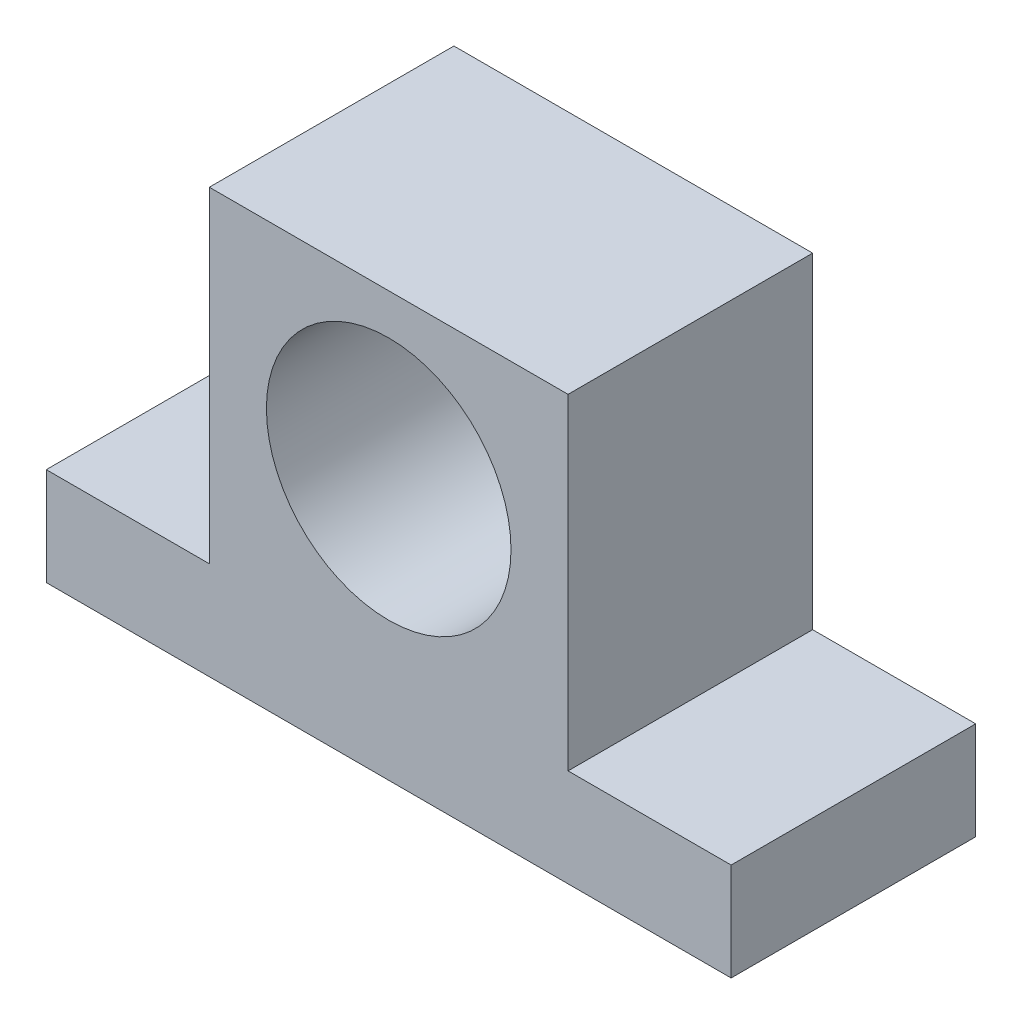
ISO-10303-21;
HEADER;
FILE_DESCRIPTION(('STEP AP214'),'2;1');
FILE_NAME('part.step','',(''),(''),'','','');
FILE_SCHEMA(('AUTOMOTIVE_DESIGN { 1 0 10303 214 1 1 1 1 }'));
ENDSEC;
DATA;
#1=APPLICATION_CONTEXT('core data for automotive mechanical design processes');
#2=APPLICATION_PROTOCOL_DEFINITION('international standard','automotive_design',2000,#1);
#3=PRODUCT_CONTEXT('',#1,'mechanical');
#4=PRODUCT('Part','Part','',(#3));
#5=PRODUCT_RELATED_PRODUCT_CATEGORY('part','',(#4));
#6=PRODUCT_DEFINITION_FORMATION('','',#4);
#7=PRODUCT_DEFINITION_CONTEXT('part definition',#1,'design');
#8=PRODUCT_DEFINITION('design','',#6,#7);
#9=PRODUCT_DEFINITION_SHAPE('','',#8);
#10=(LENGTH_UNIT() NAMED_UNIT(*) SI_UNIT(.MILLI.,.METRE.));
#11=(NAMED_UNIT(*) PLANE_ANGLE_UNIT() SI_UNIT($,.RADIAN.));
#12=(NAMED_UNIT(*) SI_UNIT($,.STERADIAN.) SOLID_ANGLE_UNIT());
#13=UNCERTAINTY_MEASURE_WITH_UNIT(LENGTH_MEASURE(1.E-05),#10,'distance_accuracy_value','');
#14=(GEOMETRIC_REPRESENTATION_CONTEXT(3) GLOBAL_UNCERTAINTY_ASSIGNED_CONTEXT((#13)) GLOBAL_UNIT_ASSIGNED_CONTEXT((#10,
#11,#12)) REPRESENTATION_CONTEXT('',''));
#15=CARTESIAN_POINT('',(0.,0.,0.));
#16=DIRECTION('',(0.,0.,1.));
#17=DIRECTION('',(1.,0.,0.));
#18=AXIS2_PLACEMENT_3D('',#15,#16,#17);
#19=CARTESIAN_POINT('',(0.,0.,15.));
#20=DIRECTION('',(0.,0.,1.));
#21=DIRECTION('',(1.,0.,0.));
#22=AXIS2_PLACEMENT_3D('',#19,#20,#21);
#23=PLANE('',#22);
#24=DIRECTION('',(0.,-1.,0.));
#25=VECTOR('',#24,1.);
#26=CARTESIAN_POINT('',(-11.,-10.,15.));
#27=LINE('',#26,#25);
#28=CARTESIAN_POINT('',(-11.,10.,15.));
#29=VERTEX_POINT('',#28);
#30=CARTESIAN_POINT('',(-11.,-10.,15.));
#31=VERTEX_POINT('',#30);
#32=EDGE_CURVE('E170',#29,#31,#27,.T.);
#33=ORIENTED_EDGE('',*,*,#32,.T.);
#34=DIRECTION('',(-1.,0.,0.));
#35=VECTOR('',#34,1.);
#36=CARTESIAN_POINT('',(-21.,-10.,15.));
#37=LINE('',#36,#35);
#38=CARTESIAN_POINT('',(-21.,-10.,15.));
#39=VERTEX_POINT('',#38);
#40=EDGE_CURVE('E106',#31,#39,#37,.T.);
#41=ORIENTED_EDGE('',*,*,#40,.T.);
#42=DIRECTION('',(0.,-1.,0.));
#43=VECTOR('',#42,1.);
#44=CARTESIAN_POINT('',(-21.,-10.,15.));
#45=LINE('',#44,#43);
#46=CARTESIAN_POINT('',(-21.,-16.,15.));
#47=VERTEX_POINT('',#46);
#48=EDGE_CURVE('E191',#39,#47,#45,.T.);
#49=ORIENTED_EDGE('',*,*,#48,.T.);
#50=DIRECTION('',(1.,0.,0.));
#51=VECTOR('',#50,1.);
#52=CARTESIAN_POINT('',(-21.,-16.,15.));
#53=LINE('',#52,#51);
#54=CARTESIAN_POINT('',(21.,-16.,15.));
#55=VERTEX_POINT('',#54);
#56=EDGE_CURVE('E205',#47,#55,#53,.T.);
#57=ORIENTED_EDGE('',*,*,#56,.T.);
#58=DIRECTION('',(0.,1.,0.));
#59=VECTOR('',#58,1.);
#60=CARTESIAN_POINT('',(21.,-10.,15.));
#61=LINE('',#60,#59);
#62=CARTESIAN_POINT('',(21.,-10.,15.));
#63=VERTEX_POINT('',#62);
#64=EDGE_CURVE('E125',#55,#63,#61,.T.);
#65=ORIENTED_EDGE('',*,*,#64,.T.);
#66=DIRECTION('',(-1.,0.,0.));
#67=VECTOR('',#66,1.);
#68=CARTESIAN_POINT('',(11.,-10.,15.));
#69=LINE('',#68,#67);
#70=CARTESIAN_POINT('',(11.,-10.,15.));
#71=VERTEX_POINT('',#70);
#72=EDGE_CURVE('E119',#63,#71,#69,.T.);
#73=ORIENTED_EDGE('',*,*,#72,.T.);
#74=DIRECTION('',(0.,1.,0.));
#75=VECTOR('',#74,1.);
#76=CARTESIAN_POINT('',(11.,-10.,15.));
#77=LINE('',#76,#75);
#78=CARTESIAN_POINT('',(11.,10.,15.));
#79=VERTEX_POINT('',#78);
#80=EDGE_CURVE('E123',#71,#79,#77,.T.);
#81=ORIENTED_EDGE('',*,*,#80,.T.);
#82=DIRECTION('',(-1.,0.,0.));
#83=VECTOR('',#82,1.);
#84=CARTESIAN_POINT('',(11.,10.,15.));
#85=LINE('',#84,#83);
#86=EDGE_CURVE('E63',#79,#29,#85,.T.);
#87=ORIENTED_EDGE('',*,*,#86,.T.);
#88=EDGE_LOOP('',(#33,#41,#49,#57,#65,#73,#81,#87));
#89=FACE_BOUND('',#88,.T.);
#90=CARTESIAN_POINT('',(0.,0.,15.));
#91=DIRECTION('',(0.,0.,1.));
#92=DIRECTION('',(1.,0.,0.));
#93=AXIS2_PLACEMENT_3D('',#90,#91,#92);
#94=CIRCLE('',#93,7.5);
#95=CARTESIAN_POINT('',(7.5,0.,15.));
#96=VERTEX_POINT('',#95);
#97=EDGE_CURVE('E152',#96,#96,#94,.T.);
#98=ORIENTED_EDGE('',*,*,#97,.F.);
#99=EDGE_LOOP('',(#98));
#100=FACE_BOUND('',#99,.T.);
#101=ADVANCED_FACE('F45',(#89,#100),#23,.T.);
#102=CARTESIAN_POINT('',(0.,0.,0.));
#103=DIRECTION('',(0.,0.,1.));
#104=DIRECTION('',(1.,0.,0.));
#105=AXIS2_PLACEMENT_3D('',#102,#103,#104);
#106=PLANE('',#105);
#107=DIRECTION('',(0.,-1.,0.));
#108=VECTOR('',#107,1.);
#109=CARTESIAN_POINT('',(-11.,-10.,0.));
#110=LINE('',#109,#108);
#111=CARTESIAN_POINT('',(-11.,10.,0.));
#112=VERTEX_POINT('',#111);
#113=CARTESIAN_POINT('',(-11.,-10.,0.));
#114=VERTEX_POINT('',#113);
#115=EDGE_CURVE('E147',#112,#114,#110,.T.);
#116=ORIENTED_EDGE('',*,*,#115,.F.);
#117=DIRECTION('',(-1.,0.,0.));
#118=VECTOR('',#117,1.);
#119=CARTESIAN_POINT('',(11.,10.,0.));
#120=LINE('',#119,#118);
#121=CARTESIAN_POINT('',(11.,10.,0.));
#122=VERTEX_POINT('',#121);
#123=EDGE_CURVE('E98',#122,#112,#120,.T.);
#124=ORIENTED_EDGE('',*,*,#123,.F.);
#125=DIRECTION('',(0.,1.,0.));
#126=VECTOR('',#125,1.);
#127=CARTESIAN_POINT('',(11.,-10.,0.));
#128=LINE('',#127,#126);
#129=CARTESIAN_POINT('',(11.,-10.,0.));
#130=VERTEX_POINT('',#129);
#131=EDGE_CURVE('E92',#130,#122,#128,.T.);
#132=ORIENTED_EDGE('',*,*,#131,.F.);
#133=DIRECTION('',(-1.,0.,0.));
#134=VECTOR('',#133,1.);
#135=CARTESIAN_POINT('',(11.,-10.,0.));
#136=LINE('',#135,#134);
#137=CARTESIAN_POINT('',(21.,-10.,0.));
#138=VERTEX_POINT('',#137);
#139=EDGE_CURVE('E134',#138,#130,#136,.T.);
#140=ORIENTED_EDGE('',*,*,#139,.F.);
#141=DIRECTION('',(0.,1.,0.));
#142=VECTOR('',#141,1.);
#143=CARTESIAN_POINT('',(21.,-10.,0.));
#144=LINE('',#143,#142);
#145=CARTESIAN_POINT('',(21.,-16.,0.));
#146=VERTEX_POINT('',#145);
#147=EDGE_CURVE('E161',#146,#138,#144,.T.);
#148=ORIENTED_EDGE('',*,*,#147,.F.);
#149=DIRECTION('',(1.,0.,0.));
#150=VECTOR('',#149,1.);
#151=CARTESIAN_POINT('',(-21.,-16.,0.));
#152=LINE('',#151,#150);
#153=CARTESIAN_POINT('',(-21.,-16.,0.));
#154=VERTEX_POINT('',#153);
#155=EDGE_CURVE('E158',#154,#146,#152,.T.);
#156=ORIENTED_EDGE('',*,*,#155,.F.);
#157=DIRECTION('',(0.,-1.,0.));
#158=VECTOR('',#157,1.);
#159=CARTESIAN_POINT('',(-21.,-10.,0.));
#160=LINE('',#159,#158);
#161=CARTESIAN_POINT('',(-21.,-10.,0.));
#162=VERTEX_POINT('',#161);
#163=EDGE_CURVE('E155',#162,#154,#160,.T.);
#164=ORIENTED_EDGE('',*,*,#163,.F.);
#165=DIRECTION('',(-1.,0.,0.));
#166=VECTOR('',#165,1.);
#167=CARTESIAN_POINT('',(-21.,-10.,0.));
#168=LINE('',#167,#166);
#169=EDGE_CURVE('E151',#114,#162,#168,.T.);
#170=ORIENTED_EDGE('',*,*,#169,.F.);
#171=EDGE_LOOP('',(#116,#124,#132,#140,#148,#156,#164,#170));
#172=FACE_BOUND('',#171,.T.);
#173=CARTESIAN_POINT('',(0.,0.,0.));
#174=DIRECTION('',(0.,0.,1.));
#175=DIRECTION('',(1.,0.,0.));
#176=AXIS2_PLACEMENT_3D('',#173,#174,#175);
#177=CIRCLE('',#176,7.5);
#178=CARTESIAN_POINT('',(7.5,0.,0.));
#179=VERTEX_POINT('',#178);
#180=EDGE_CURVE('E215',#179,#179,#177,.T.);
#181=ORIENTED_EDGE('',*,*,#180,.T.);
#182=EDGE_LOOP('',(#181));
#183=FACE_BOUND('',#182,.T.);
#184=ADVANCED_FACE('F195',(#172,#183),#106,.F.);
#185=CARTESIAN_POINT('',(-11.,-10.,15.));
#186=DIRECTION('',(1.,0.,0.));
#187=DIRECTION('',(0.,0.,-1.));
#188=AXIS2_PLACEMENT_3D('',#185,#186,#187);
#189=PLANE('',#188);
#190=ORIENTED_EDGE('',*,*,#115,.T.);
#191=DIRECTION('',(0.,0.,-1.));
#192=VECTOR('',#191,1.);
#193=CARTESIAN_POINT('',(-11.,-10.,15.));
#194=LINE('',#193,#192);
#195=EDGE_CURVE('E11',#31,#114,#194,.T.);
#196=ORIENTED_EDGE('',*,*,#195,.F.);
#197=ORIENTED_EDGE('',*,*,#32,.F.);
#198=DIRECTION('',(0.,0.,-1.));
#199=VECTOR('',#198,1.);
#200=CARTESIAN_POINT('',(-11.,10.,15.));
#201=LINE('',#200,#199);
#202=EDGE_CURVE('E143',#29,#112,#201,.T.);
#203=ORIENTED_EDGE('',*,*,#202,.T.);
#204=EDGE_LOOP('',(#190,#196,#197,#203));
#205=FACE_BOUND('',#204,.T.);
#206=ADVANCED_FACE('F47',(#205),#189,.F.);
#207=CARTESIAN_POINT('',(-21.,-10.,15.));
#208=DIRECTION('',(0.,-1.,0.));
#209=DIRECTION('',(0.,0.,-1.));
#210=AXIS2_PLACEMENT_3D('',#207,#208,#209);
#211=PLANE('',#210);
#212=ORIENTED_EDGE('',*,*,#169,.T.);
#213=DIRECTION('',(0.,0.,-1.));
#214=VECTOR('',#213,1.);
#215=CARTESIAN_POINT('',(-21.,-10.,15.));
#216=LINE('',#215,#214);
#217=EDGE_CURVE('E55',#39,#162,#216,.T.);
#218=ORIENTED_EDGE('',*,*,#217,.F.);
#219=ORIENTED_EDGE('',*,*,#40,.F.);
#220=ORIENTED_EDGE('',*,*,#195,.T.);
#221=EDGE_LOOP('',(#212,#218,#219,#220));
#222=FACE_BOUND('',#221,.T.);
#223=ADVANCED_FACE('F245',(#222),#211,.F.);
#224=CARTESIAN_POINT('',(-21.,-10.,15.));
#225=DIRECTION('',(1.,0.,0.));
#226=DIRECTION('',(0.,0.,-1.));
#227=AXIS2_PLACEMENT_3D('',#224,#225,#226);
#228=PLANE('',#227);
#229=ORIENTED_EDGE('',*,*,#163,.T.);
#230=DIRECTION('',(0.,0.,-1.));
#231=VECTOR('',#230,1.);
#232=CARTESIAN_POINT('',(-21.,-16.,15.));
#233=LINE('',#232,#231);
#234=EDGE_CURVE('E181',#47,#154,#233,.T.);
#235=ORIENTED_EDGE('',*,*,#234,.F.);
#236=ORIENTED_EDGE('',*,*,#48,.F.);
#237=ORIENTED_EDGE('',*,*,#217,.T.);
#238=EDGE_LOOP('',(#229,#235,#236,#237));
#239=FACE_BOUND('',#238,.T.);
#240=ADVANCED_FACE('F189',(#239),#228,.F.);
#241=CARTESIAN_POINT('',(-21.,-16.,15.));
#242=DIRECTION('',(0.,1.,0.));
#243=DIRECTION('',(0.,0.,1.));
#244=AXIS2_PLACEMENT_3D('',#241,#242,#243);
#245=PLANE('',#244);
#246=ORIENTED_EDGE('',*,*,#155,.T.);
#247=DIRECTION('',(0.,0.,-1.));
#248=VECTOR('',#247,1.);
#249=CARTESIAN_POINT('',(21.,-16.,15.));
#250=LINE('',#249,#248);
#251=EDGE_CURVE('E177',#55,#146,#250,.T.);
#252=ORIENTED_EDGE('',*,*,#251,.F.);
#253=ORIENTED_EDGE('',*,*,#56,.F.);
#254=ORIENTED_EDGE('',*,*,#234,.T.);
#255=EDGE_LOOP('',(#246,#252,#253,#254));
#256=FACE_BOUND('',#255,.T.);
#257=ADVANCED_FACE('F200',(#256),#245,.F.);
#258=CARTESIAN_POINT('',(21.,-10.,15.));
#259=DIRECTION('',(-1.,0.,0.));
#260=DIRECTION('',(0.,0.,1.));
#261=AXIS2_PLACEMENT_3D('',#258,#259,#260);
#262=PLANE('',#261);
#263=ORIENTED_EDGE('',*,*,#147,.T.);
#264=DIRECTION('',(0.,0.,-1.));
#265=VECTOR('',#264,1.);
#266=CARTESIAN_POINT('',(21.,-10.,15.));
#267=LINE('',#266,#265);
#268=EDGE_CURVE('E136',#63,#138,#267,.T.);
#269=ORIENTED_EDGE('',*,*,#268,.F.);
#270=ORIENTED_EDGE('',*,*,#64,.F.);
#271=ORIENTED_EDGE('',*,*,#251,.T.);
#272=EDGE_LOOP('',(#263,#269,#270,#271));
#273=FACE_BOUND('',#272,.T.);
#274=ADVANCED_FACE('F203',(#273),#262,.F.);
#275=CARTESIAN_POINT('',(11.,-10.,15.));
#276=DIRECTION('',(0.,-1.,0.));
#277=DIRECTION('',(1.,0.,0.));
#278=AXIS2_PLACEMENT_3D('',#275,#276,#277);
#279=PLANE('',#278);
#280=ORIENTED_EDGE('',*,*,#139,.T.);
#281=DIRECTION('',(0.,0.,-1.));
#282=VECTOR('',#281,1.);
#283=CARTESIAN_POINT('',(11.,-10.,15.));
#284=LINE('',#283,#282);
#285=EDGE_CURVE('E131',#71,#130,#284,.T.);
#286=ORIENTED_EDGE('',*,*,#285,.F.);
#287=ORIENTED_EDGE('',*,*,#72,.F.);
#288=ORIENTED_EDGE('',*,*,#268,.T.);
#289=EDGE_LOOP('',(#280,#286,#287,#288));
#290=FACE_BOUND('',#289,.T.);
#291=ADVANCED_FACE('F132',(#290),#279,.F.);
#292=CARTESIAN_POINT('',(11.,-10.,15.));
#293=DIRECTION('',(-1.,0.,0.));
#294=DIRECTION('',(0.,0.,1.));
#295=AXIS2_PLACEMENT_3D('',#292,#293,#294);
#296=PLANE('',#295);
#297=ORIENTED_EDGE('',*,*,#131,.T.);
#298=DIRECTION('',(0.,0.,-1.));
#299=VECTOR('',#298,1.);
#300=CARTESIAN_POINT('',(11.,10.,15.));
#301=LINE('',#300,#299);
#302=EDGE_CURVE('E137',#79,#122,#301,.T.);
#303=ORIENTED_EDGE('',*,*,#302,.F.);
#304=ORIENTED_EDGE('',*,*,#80,.F.);
#305=ORIENTED_EDGE('',*,*,#285,.T.);
#306=EDGE_LOOP('',(#297,#303,#304,#305));
#307=FACE_BOUND('',#306,.T.);
#308=ADVANCED_FACE('F139',(#307),#296,.F.);
#309=CARTESIAN_POINT('',(11.,10.,15.));
#310=DIRECTION('',(0.,-1.,0.));
#311=DIRECTION('',(1.,0.,0.));
#312=AXIS2_PLACEMENT_3D('',#309,#310,#311);
#313=PLANE('',#312);
#314=ORIENTED_EDGE('',*,*,#123,.T.);
#315=ORIENTED_EDGE('',*,*,#202,.F.);
#316=ORIENTED_EDGE('',*,*,#86,.F.);
#317=ORIENTED_EDGE('',*,*,#302,.T.);
#318=EDGE_LOOP('',(#314,#315,#316,#317));
#319=FACE_BOUND('',#318,.T.);
#320=ADVANCED_FACE('F233',(#319),#313,.F.);
#321=CARTESIAN_POINT('',(0.,0.,15.));
#322=DIRECTION('',(0.,0.,-1.));
#323=DIRECTION('',(-1.,0.,0.));
#324=AXIS2_PLACEMENT_3D('',#321,#322,#323);
#325=CYLINDRICAL_SURFACE('',#324,7.5);
#326=ORIENTED_EDGE('',*,*,#97,.T.);
#327=EDGE_LOOP('',(#326));
#328=FACE_BOUND('',#327,.T.);
#329=ORIENTED_EDGE('',*,*,#180,.F.);
#330=EDGE_LOOP('',(#329));
#331=FACE_BOUND('',#330,.T.);
#332=ADVANCED_FACE('F223',(#328,#331),#325,.F.);
#333=CLOSED_SHELL('',(#101,#184,#206,#223,#240,#257,#274,#291,#308,#320,#332));
#334=MANIFOLD_SOLID_BREP('B2',#333);
#335=ADVANCED_BREP_SHAPE_REPRESENTATION('',(#18,#334),#14);
#336=SHAPE_DEFINITION_REPRESENTATION(#9,#335);
ENDSEC;
END-ISO-10303-21;
